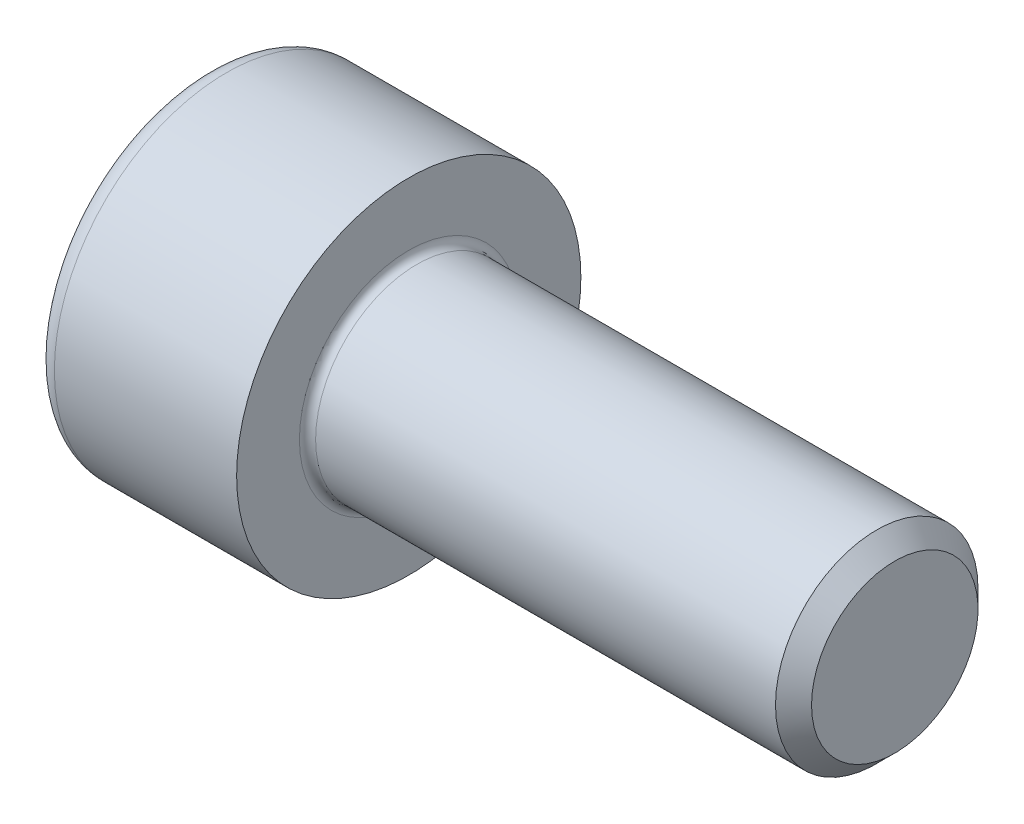
ISO-10303-21;
HEADER;
FILE_DESCRIPTION(('STEP AP214'),'2;1');
FILE_NAME('part.step','',(''),(''),'','','');
FILE_SCHEMA(('AUTOMOTIVE_DESIGN { 1 0 10303 214 1 1 1 1 }'));
ENDSEC;
DATA;
#1=APPLICATION_CONTEXT('core data for automotive mechanical design processes');
#2=APPLICATION_PROTOCOL_DEFINITION('international standard','automotive_design',2000,#1);
#3=PRODUCT_CONTEXT('',#1,'mechanical');
#4=PRODUCT('Part','Part','',(#3));
#5=PRODUCT_RELATED_PRODUCT_CATEGORY('part','',(#4));
#6=PRODUCT_DEFINITION_FORMATION('','',#4);
#7=PRODUCT_DEFINITION_CONTEXT('part definition',#1,'design');
#8=PRODUCT_DEFINITION('design','',#6,#7);
#9=PRODUCT_DEFINITION_SHAPE('','',#8);
#10=(LENGTH_UNIT() NAMED_UNIT(*) SI_UNIT(.MILLI.,.METRE.));
#11=(NAMED_UNIT(*) PLANE_ANGLE_UNIT() SI_UNIT($,.RADIAN.));
#12=(NAMED_UNIT(*) SI_UNIT($,.STERADIAN.) SOLID_ANGLE_UNIT());
#13=UNCERTAINTY_MEASURE_WITH_UNIT(LENGTH_MEASURE(1.E-05),#10,'distance_accuracy_value','');
#14=(GEOMETRIC_REPRESENTATION_CONTEXT(3) GLOBAL_UNCERTAINTY_ASSIGNED_CONTEXT((#13)) GLOBAL_UNIT_ASSIGNED_CONTEXT((#10,
#11,#12)) REPRESENTATION_CONTEXT('',''));
#15=CARTESIAN_POINT('',(0.,0.,0.));
#16=DIRECTION('',(0.,0.,1.));
#17=DIRECTION('',(1.,0.,0.));
#18=AXIS2_PLACEMENT_3D('',#15,#16,#17);
#19=CARTESIAN_POINT('',(2.5,1.16047404107115,2.01));
#20=DIRECTION('',(-1.,0.,0.));
#21=DIRECTION('',(0.,0.,1.));
#22=AXIS2_PLACEMENT_3D('',#19,#20,#21);
#23=PLANE('',#22);
#24=DIRECTION('',(0.,0.500000000000001,0.866025403784438));
#25=VECTOR('',#24,1.);
#26=CARTESIAN_POINT('',(2.5,-1.74071106160672,1.005));
#27=LINE('',#26,#25);
#28=CARTESIAN_POINT('',(2.50000000000648,-1.74071106159992,1.00499999999608));
#29=VERTEX_POINT('',#28);
#30=CARTESIAN_POINT('',(2.5,-1.16047404107115,2.01));
#31=VERTEX_POINT('',#30);
#32=EDGE_CURVE('E106',#29,#31,#27,.T.);
#33=ORIENTED_EDGE('',*,*,#32,.T.);
#34=DIRECTION('',(0.,1.,0.));
#35=VECTOR('',#34,1.);
#36=CARTESIAN_POINT('',(2.5,1.16047404107115,2.01));
#37=LINE('',#36,#35);
#38=CARTESIAN_POINT('',(2.50000000002785,0.,2.00999999995344));
#39=VERTEX_POINT('',#38);
#40=EDGE_CURVE('E101',#31,#39,#37,.T.);
#41=ORIENTED_EDGE('',*,*,#40,.T.);
#42=CARTESIAN_POINT('',(2.50000000001296,0.,0.));
#43=DIRECTION('',(-1.,0.,0.));
#44=DIRECTION('',(0.,0.,1.));
#45=AXIS2_PLACEMENT_3D('',#42,#43,#44);
#46=CIRCLE('',#45,2.0099999999843);
#47=EDGE_CURVE('E103',#39,#29,#46,.F.);
#48=ORIENTED_EDGE('',*,*,#47,.T.);
#49=EDGE_LOOP('',(#33,#41,#48));
#50=FACE_BOUND('',#49,.T.);
#51=ADVANCED_FACE('F16',(#50),#23,.T.);
#52=CARTESIAN_POINT('',(2.5,1.16047404107115,2.01));
#53=DIRECTION('',(-1.,0.,0.));
#54=DIRECTION('',(0.,0.,1.));
#55=AXIS2_PLACEMENT_3D('',#52,#53,#54);
#56=PLANE('',#55);
#57=DIRECTION('',(0.,-0.499999999999998,0.86602540378444));
#58=VECTOR('',#57,1.);
#59=CARTESIAN_POINT('',(2.5,-1.74071106160673,-1.005));
#60=LINE('',#59,#58);
#61=CARTESIAN_POINT('',(2.50000000000648,-1.74071106159993,-1.00499999999608));
#62=VERTEX_POINT('',#61);
#63=CARTESIAN_POINT('',(2.5,-2.3209480821423,0.));
#64=VERTEX_POINT('',#63);
#65=EDGE_CURVE('E110',#62,#64,#60,.T.);
#66=ORIENTED_EDGE('',*,*,#65,.T.);
#67=DIRECTION('',(0.,0.500000000000001,0.866025403784438));
#68=VECTOR('',#67,1.);
#69=CARTESIAN_POINT('',(2.5,-2.3209480821423,0.));
#70=LINE('',#69,#68);
#71=EDGE_CURVE('E178',#64,#29,#70,.T.);
#72=ORIENTED_EDGE('',*,*,#71,.T.);
#73=CARTESIAN_POINT('',(2.50000000001296,0.,0.));
#74=DIRECTION('',(-1.,0.,0.));
#75=DIRECTION('',(0.,0.,1.));
#76=AXIS2_PLACEMENT_3D('',#73,#74,#75);
#77=CIRCLE('',#76,2.0099999999843);
#78=EDGE_CURVE('E122',#29,#62,#77,.F.);
#79=ORIENTED_EDGE('',*,*,#78,.T.);
#80=EDGE_LOOP('',(#66,#72,#79));
#81=FACE_BOUND('',#80,.T.);
#82=ADVANCED_FACE('F365',(#81),#56,.T.);
#83=CARTESIAN_POINT('',(2.5,1.16047404107115,2.01));
#84=DIRECTION('',(-1.,0.,0.));
#85=DIRECTION('',(0.,0.,1.));
#86=AXIS2_PLACEMENT_3D('',#83,#84,#85);
#87=PLANE('',#86);
#88=DIRECTION('',(0.,1.,0.));
#89=VECTOR('',#88,1.);
#90=CARTESIAN_POINT('',(2.5,1.16047404107115,-2.01));
#91=LINE('',#90,#89);
#92=CARTESIAN_POINT('',(2.50000000002785,0.,-2.00999999995345));
#93=VERTEX_POINT('',#92);
#94=CARTESIAN_POINT('',(2.5,-1.16047404107115,-2.01));
#95=VERTEX_POINT('',#94);
#96=EDGE_CURVE('E173',#93,#95,#91,.F.);
#97=ORIENTED_EDGE('',*,*,#96,.T.);
#98=DIRECTION('',(0.,-0.499999999999999,0.866025403784439));
#99=VECTOR('',#98,1.);
#100=CARTESIAN_POINT('',(2.5,-1.16047404107116,-2.01));
#101=LINE('',#100,#99);
#102=EDGE_CURVE('E168',#95,#62,#101,.T.);
#103=ORIENTED_EDGE('',*,*,#102,.T.);
#104=CARTESIAN_POINT('',(2.50000000001296,0.,0.));
#105=DIRECTION('',(-1.,0.,0.));
#106=DIRECTION('',(0.,0.,1.));
#107=AXIS2_PLACEMENT_3D('',#104,#105,#106);
#108=CIRCLE('',#107,2.0099999999843);
#109=EDGE_CURVE('E228',#62,#93,#108,.F.);
#110=ORIENTED_EDGE('',*,*,#109,.T.);
#111=EDGE_LOOP('',(#97,#103,#110));
#112=FACE_BOUND('',#111,.T.);
#113=ADVANCED_FACE('F360',(#112),#87,.T.);
#114=CARTESIAN_POINT('',(2.5,1.16047404107115,2.01));
#115=DIRECTION('',(-1.,0.,0.));
#116=DIRECTION('',(0.,0.,1.));
#117=AXIS2_PLACEMENT_3D('',#114,#115,#116);
#118=PLANE('',#117);
#119=DIRECTION('',(0.,-0.500000000000001,-0.866025403784438));
#120=VECTOR('',#119,1.);
#121=CARTESIAN_POINT('',(2.5,1.74071106160672,-1.005));
#122=LINE('',#121,#120);
#123=CARTESIAN_POINT('',(2.50000000000648,1.74071106159992,-1.00499999999608));
#124=VERTEX_POINT('',#123);
#125=CARTESIAN_POINT('',(2.5,1.16047404107114,-2.01));
#126=VERTEX_POINT('',#125);
#127=EDGE_CURVE('E163',#124,#126,#122,.T.);
#128=ORIENTED_EDGE('',*,*,#127,.T.);
#129=DIRECTION('',(0.,1.,0.));
#130=VECTOR('',#129,1.);
#131=CARTESIAN_POINT('',(2.5,1.16047404107115,-2.01));
#132=LINE('',#131,#130);
#133=EDGE_CURVE('E158',#126,#93,#132,.F.);
#134=ORIENTED_EDGE('',*,*,#133,.T.);
#135=CARTESIAN_POINT('',(2.50000000001296,0.,0.));
#136=DIRECTION('',(-1.,0.,0.));
#137=DIRECTION('',(0.,0.,1.));
#138=AXIS2_PLACEMENT_3D('',#135,#136,#137);
#139=CIRCLE('',#138,2.0099999999843);
#140=EDGE_CURVE('E225',#93,#124,#139,.F.);
#141=ORIENTED_EDGE('',*,*,#140,.T.);
#142=EDGE_LOOP('',(#128,#134,#141));
#143=FACE_BOUND('',#142,.T.);
#144=ADVANCED_FACE('F354',(#143),#118,.T.);
#145=CARTESIAN_POINT('',(2.5,1.16047404107115,2.01));
#146=DIRECTION('',(-1.,0.,0.));
#147=DIRECTION('',(0.,0.,1.));
#148=AXIS2_PLACEMENT_3D('',#145,#146,#147);
#149=PLANE('',#148);
#150=DIRECTION('',(0.,0.499999999999996,-0.866025403784441));
#151=VECTOR('',#150,1.);
#152=CARTESIAN_POINT('',(2.5,1.74071106160672,1.005));
#153=LINE('',#152,#151);
#154=CARTESIAN_POINT('',(2.50000000000648,1.74071106159993,1.00499999999607));
#155=VERTEX_POINT('',#154);
#156=CARTESIAN_POINT('',(2.5,2.32094808214229,0.));
#157=VERTEX_POINT('',#156);
#158=EDGE_CURVE('E153',#155,#157,#153,.T.);
#159=ORIENTED_EDGE('',*,*,#158,.T.);
#160=DIRECTION('',(0.,-0.500000000000002,-0.866025403784438));
#161=VECTOR('',#160,1.);
#162=CARTESIAN_POINT('',(2.5,2.32094808214229,0.));
#163=LINE('',#162,#161);
#164=EDGE_CURVE('E123',#157,#124,#163,.T.);
#165=ORIENTED_EDGE('',*,*,#164,.T.);
#166=CARTESIAN_POINT('',(2.50000000001296,0.,0.));
#167=DIRECTION('',(-1.,0.,0.));
#168=DIRECTION('',(0.,0.,1.));
#169=AXIS2_PLACEMENT_3D('',#166,#167,#168);
#170=CIRCLE('',#169,2.0099999999843);
#171=EDGE_CURVE('E130',#124,#155,#170,.F.);
#172=ORIENTED_EDGE('',*,*,#171,.T.);
#173=EDGE_LOOP('',(#159,#165,#172));
#174=FACE_BOUND('',#173,.T.);
#175=ADVANCED_FACE('F351',(#174),#149,.T.);
#176=CARTESIAN_POINT('',(2.50000000011141,0.,0.));
#177=DIRECTION('',(-1.,0.,0.));
#178=DIRECTION('',(0.,0.,1.));
#179=AXIS2_PLACEMENT_3D('',#176,#177,#178);
#180=CONICAL_SURFACE('',#179,2.00999999981377,1.04719755104565);
#181=CARTESIAN_POINT('',(3.66047404099845,0.,1.13686837721616E-10));
#182=VERTEX_POINT('',#181);
#183=VERTEX_LOOP('',#182);
#184=FACE_BOUND('',#183,.T.);
#185=ORIENTED_EDGE('',*,*,#47,.F.);
#186=CARTESIAN_POINT('',(2.50000000001296,0.,0.));
#187=DIRECTION('',(-1.,0.,0.));
#188=DIRECTION('',(0.,0.,1.));
#189=AXIS2_PLACEMENT_3D('',#186,#187,#188);
#190=CIRCLE('',#189,2.0099999999843);
#191=EDGE_CURVE('E118',#155,#39,#190,.F.);
#192=ORIENTED_EDGE('',*,*,#191,.F.);
#193=ORIENTED_EDGE('',*,*,#171,.F.);
#194=ORIENTED_EDGE('',*,*,#140,.F.);
#195=ORIENTED_EDGE('',*,*,#109,.F.);
#196=ORIENTED_EDGE('',*,*,#78,.F.);
#197=EDGE_LOOP('',(#185,#192,#193,#194,#195,#196));
#198=FACE_BOUND('',#197,.T.);
#199=ADVANCED_FACE('F116',(#184,#198),#180,.F.);
#200=CARTESIAN_POINT('',(2.5,1.16047404107115,2.01));
#201=DIRECTION('',(-1.,0.,0.));
#202=DIRECTION('',(0.,0.,1.));
#203=AXIS2_PLACEMENT_3D('',#200,#201,#202);
#204=PLANE('',#203);
#205=DIRECTION('',(0.,-1.,0.));
#206=VECTOR('',#205,1.);
#207=CARTESIAN_POINT('',(2.5,-1.16047404107115,2.01));
#208=LINE('',#207,#206);
#209=CARTESIAN_POINT('',(2.5,1.16047404107115,2.01));
#210=VERTEX_POINT('',#209);
#211=EDGE_CURVE('E127',#39,#210,#208,.F.);
#212=ORIENTED_EDGE('',*,*,#211,.T.);
#213=DIRECTION('',(0.,0.499999999999999,-0.866025403784439));
#214=VECTOR('',#213,1.);
#215=CARTESIAN_POINT('',(2.5,2.32094808214229,0.));
#216=LINE('',#215,#214);
#217=EDGE_CURVE('E129',#155,#210,#216,.F.);
#218=ORIENTED_EDGE('',*,*,#217,.F.);
#219=ORIENTED_EDGE('',*,*,#191,.T.);
#220=EDGE_LOOP('',(#212,#218,#219));
#221=FACE_BOUND('',#220,.T.);
#222=ADVANCED_FACE('F126',(#221),#204,.T.);
#223=CARTESIAN_POINT('',(2.5,2.32094808214229,0.));
#224=DIRECTION('',(0.,-0.866025403784439,-0.499999999999999));
#225=DIRECTION('',(0.,0.499999999999999,-0.866025403784439));
#226=AXIS2_PLACEMENT_3D('',#223,#224,#225);
#227=PLANE('',#226);
#228=ORIENTED_EDGE('',*,*,#217,.T.);
#229=DIRECTION('',(1.,0.,0.));
#230=VECTOR('',#229,1.);
#231=CARTESIAN_POINT('',(2.5,1.16047404107115,2.01));
#232=LINE('',#231,#230);
#233=CARTESIAN_POINT('',(0.,1.16047404107115,2.01));
#234=VERTEX_POINT('',#233);
#235=EDGE_CURVE('E135',#210,#234,#232,.F.);
#236=ORIENTED_EDGE('',*,*,#235,.T.);
#237=DIRECTION('',(0.,-0.499999999999999,0.866025403784439));
#238=VECTOR('',#237,1.);
#239=CARTESIAN_POINT('',(0.,2.32094808214229,0.));
#240=LINE('',#239,#238);
#241=CARTESIAN_POINT('',(0.,2.32094808214229,0.));
#242=VERTEX_POINT('',#241);
#243=EDGE_CURVE('E201',#242,#234,#240,.T.);
#244=ORIENTED_EDGE('',*,*,#243,.F.);
#245=DIRECTION('',(1.,0.,0.));
#246=VECTOR('',#245,1.);
#247=CARTESIAN_POINT('',(2.5,2.32094808214229,0.));
#248=LINE('',#247,#246);
#249=EDGE_CURVE('E193',#242,#157,#248,.T.);
#250=ORIENTED_EDGE('',*,*,#249,.T.);
#251=ORIENTED_EDGE('',*,*,#158,.F.);
#252=EDGE_LOOP('',(#228,#236,#244,#250,#251));
#253=FACE_BOUND('',#252,.T.);
#254=ADVANCED_FACE('F347',(#253),#227,.T.);
#255=CARTESIAN_POINT('',(2.5,-1.16047404107115,2.01));
#256=DIRECTION('',(0.,0.,1.));
#257=DIRECTION('',(0.,-1.,0.));
#258=AXIS2_PLACEMENT_3D('',#255,#256,#257);
#259=PLANE('',#258);
#260=ORIENTED_EDGE('',*,*,#235,.F.);
#261=ORIENTED_EDGE('',*,*,#211,.F.);
#262=ORIENTED_EDGE('',*,*,#40,.F.);
#263=DIRECTION('',(1.,0.,0.));
#264=VECTOR('',#263,1.);
#265=CARTESIAN_POINT('',(2.5,-1.16047404107115,2.01));
#266=LINE('',#265,#264);
#267=CARTESIAN_POINT('',(0.,-1.16047404107115,2.01));
#268=VERTEX_POINT('',#267);
#269=EDGE_CURVE('E137',#268,#31,#266,.T.);
#270=ORIENTED_EDGE('',*,*,#269,.F.);
#271=DIRECTION('',(0.,1.,0.));
#272=VECTOR('',#271,1.);
#273=CARTESIAN_POINT('',(0.,0.,2.01));
#274=LINE('',#273,#272);
#275=EDGE_CURVE('E342',#234,#268,#274,.F.);
#276=ORIENTED_EDGE('',*,*,#275,.F.);
#277=EDGE_LOOP('',(#260,#261,#262,#270,#276));
#278=FACE_BOUND('',#277,.T.);
#279=ADVANCED_FACE('F133',(#278),#259,.F.);
#280=CARTESIAN_POINT('',(2.5,-1.16047404107115,2.01));
#281=DIRECTION('',(0.,0.866025403784438,-0.500000000000001));
#282=DIRECTION('',(0.,0.500000000000001,0.866025403784438));
#283=AXIS2_PLACEMENT_3D('',#280,#281,#282);
#284=PLANE('',#283);
#285=ORIENTED_EDGE('',*,*,#71,.F.);
#286=DIRECTION('',(1.,0.,0.));
#287=VECTOR('',#286,1.);
#288=CARTESIAN_POINT('',(2.5,-2.3209480821423,0.));
#289=LINE('',#288,#287);
#290=CARTESIAN_POINT('',(0.,-2.3209480821423,0.));
#291=VERTEX_POINT('',#290);
#292=EDGE_CURVE('E205',#291,#64,#289,.T.);
#293=ORIENTED_EDGE('',*,*,#292,.F.);
#294=DIRECTION('',(0.,-0.500000000000001,-0.866025403784438));
#295=VECTOR('',#294,1.);
#296=CARTESIAN_POINT('',(0.,-1.16047404107115,2.01));
#297=LINE('',#296,#295);
#298=EDGE_CURVE('E339',#268,#291,#297,.T.);
#299=ORIENTED_EDGE('',*,*,#298,.F.);
#300=ORIENTED_EDGE('',*,*,#269,.T.);
#301=ORIENTED_EDGE('',*,*,#32,.F.);
#302=EDGE_LOOP('',(#285,#293,#299,#300,#301));
#303=FACE_BOUND('',#302,.T.);
#304=ADVANCED_FACE('F367',(#303),#284,.T.);
#305=CARTESIAN_POINT('',(2.5,-2.3209480821423,0.));
#306=DIRECTION('',(0.,0.866025403784439,0.499999999999999));
#307=DIRECTION('',(0.,-0.499999999999999,0.866025403784439));
#308=AXIS2_PLACEMENT_3D('',#305,#306,#307);
#309=PLANE('',#308);
#310=ORIENTED_EDGE('',*,*,#102,.F.);
#311=DIRECTION('',(1.,0.,0.));
#312=VECTOR('',#311,1.);
#313=CARTESIAN_POINT('',(2.5,-1.16047404107116,-2.01));
#314=LINE('',#313,#312);
#315=CARTESIAN_POINT('',(0.,-1.16047404107116,-2.01));
#316=VERTEX_POINT('',#315);
#317=EDGE_CURVE('E197',#95,#316,#314,.F.);
#318=ORIENTED_EDGE('',*,*,#317,.T.);
#319=DIRECTION('',(0.,0.499999999999999,-0.86602540378444));
#320=VECTOR('',#319,1.);
#321=CARTESIAN_POINT('',(0.,-2.3209480821423,0.));
#322=LINE('',#321,#320);
#323=EDGE_CURVE('E334',#291,#316,#322,.T.);
#324=ORIENTED_EDGE('',*,*,#323,.F.);
#325=ORIENTED_EDGE('',*,*,#292,.T.);
#326=ORIENTED_EDGE('',*,*,#65,.F.);
#327=EDGE_LOOP('',(#310,#318,#324,#325,#326));
#328=FACE_BOUND('',#327,.T.);
#329=ADVANCED_FACE('F362',(#328),#309,.T.);
#330=CARTESIAN_POINT('',(2.5,1.16047404107114,-2.01));
#331=DIRECTION('',(0.,0.,-1.));
#332=DIRECTION('',(0.,1.,0.));
#333=AXIS2_PLACEMENT_3D('',#330,#331,#332);
#334=PLANE('',#333);
#335=ORIENTED_EDGE('',*,*,#317,.F.);
#336=ORIENTED_EDGE('',*,*,#96,.F.);
#337=ORIENTED_EDGE('',*,*,#133,.F.);
#338=DIRECTION('',(1.,0.,0.));
#339=VECTOR('',#338,1.);
#340=CARTESIAN_POINT('',(2.5,1.16047404107114,-2.01));
#341=LINE('',#340,#339);
#342=CARTESIAN_POINT('',(0.,1.16047404107114,-2.01));
#343=VERTEX_POINT('',#342);
#344=EDGE_CURVE('E196',#126,#343,#341,.F.);
#345=ORIENTED_EDGE('',*,*,#344,.T.);
#346=DIRECTION('',(0.,1.,0.));
#347=VECTOR('',#346,1.);
#348=CARTESIAN_POINT('',(0.,0.,-2.01));
#349=LINE('',#348,#347);
#350=EDGE_CURVE('E330',#316,#343,#349,.T.);
#351=ORIENTED_EDGE('',*,*,#350,.F.);
#352=EDGE_LOOP('',(#335,#336,#337,#345,#351));
#353=FACE_BOUND('',#352,.T.);
#354=ADVANCED_FACE('F357',(#353),#334,.F.);
#355=CARTESIAN_POINT('',(2.5,2.32094808214229,0.));
#356=DIRECTION('',(0.,0.866025403784438,-0.500000000000001));
#357=DIRECTION('',(0.,0.500000000000001,0.866025403784438));
#358=AXIS2_PLACEMENT_3D('',#355,#356,#357);
#359=PLANE('',#358);
#360=ORIENTED_EDGE('',*,*,#344,.F.);
#361=ORIENTED_EDGE('',*,*,#127,.F.);
#362=ORIENTED_EDGE('',*,*,#164,.F.);
#363=ORIENTED_EDGE('',*,*,#249,.F.);
#364=DIRECTION('',(0.,0.500000000000002,0.866025403784438));
#365=VECTOR('',#364,1.);
#366=CARTESIAN_POINT('',(0.,1.16047404107114,-2.01));
#367=LINE('',#366,#365);
#368=EDGE_CURVE('E328',#343,#242,#367,.T.);
#369=ORIENTED_EDGE('',*,*,#368,.F.);
#370=EDGE_LOOP('',(#360,#361,#362,#363,#369));
#371=FACE_BOUND('',#370,.T.);
#372=ADVANCED_FACE('F304',(#371),#359,.F.);
#373=CARTESIAN_POINT('',(0.,0.,0.));
#374=DIRECTION('',(-1.,0.,0.));
#375=DIRECTION('',(0.,0.,1.));
#376=AXIS2_PLACEMENT_3D('',#373,#374,#375);
#377=PLANE('',#376);
#378=CARTESIAN_POINT('',(0.,0.,0.));
#379=DIRECTION('',(1.,0.,0.));
#380=DIRECTION('',(0.,0.,-1.));
#381=AXIS2_PLACEMENT_3D('',#378,#379,#380);
#382=CIRCLE('',#381,3.75);
#383=CARTESIAN_POINT('',(0.,0.,-3.75));
#384=VERTEX_POINT('',#383);
#385=CARTESIAN_POINT('',(0.,0.,3.75));
#386=VERTEX_POINT('',#385);
#387=EDGE_CURVE('E325',#384,#386,#382,.T.);
#388=ORIENTED_EDGE('',*,*,#387,.F.);
#389=CARTESIAN_POINT('',(0.,0.,0.));
#390=DIRECTION('',(1.,0.,0.));
#391=DIRECTION('',(0.,0.,1.));
#392=AXIS2_PLACEMENT_3D('',#389,#390,#391);
#393=CIRCLE('',#392,3.75);
#394=EDGE_CURVE('E323',#386,#384,#393,.T.);
#395=ORIENTED_EDGE('',*,*,#394,.F.);
#396=EDGE_LOOP('',(#388,#395));
#397=FACE_BOUND('',#396,.T.);
#398=ORIENTED_EDGE('',*,*,#350,.T.);
#399=ORIENTED_EDGE('',*,*,#368,.T.);
#400=ORIENTED_EDGE('',*,*,#243,.T.);
#401=ORIENTED_EDGE('',*,*,#275,.T.);
#402=ORIENTED_EDGE('',*,*,#298,.T.);
#403=ORIENTED_EDGE('',*,*,#323,.T.);
#404=EDGE_LOOP('',(#398,#399,#400,#401,#402,#403));
#405=FACE_BOUND('',#404,.T.);
#406=ADVANCED_FACE('F298',(#397,#405),#377,.T.);
#407=CARTESIAN_POINT('',(0.5,0.,0.));
#408=DIRECTION('',(-1.,0.,0.));
#409=DIRECTION('',(0.,0.,1.));
#410=AXIS2_PLACEMENT_3D('',#407,#408,#409);
#411=TOROIDAL_SURFACE('',#410,3.75,0.5);
#412=CARTESIAN_POINT('',(0.5,0.,0.));
#413=DIRECTION('',(-1.,0.,0.));
#414=DIRECTION('',(0.,0.,1.));
#415=AXIS2_PLACEMENT_3D('',#412,#413,#414);
#416=CIRCLE('',#415,4.25);
#417=CARTESIAN_POINT('',(0.5,0.,4.25));
#418=VERTEX_POINT('',#417);
#419=EDGE_CURVE('E221',#418,#418,#416,.F.);
#420=ORIENTED_EDGE('',*,*,#419,.F.);
#421=EDGE_LOOP('',(#420));
#422=FACE_BOUND('',#421,.T.);
#423=ORIENTED_EDGE('',*,*,#394,.T.);
#424=ORIENTED_EDGE('',*,*,#387,.T.);
#425=EDGE_LOOP('',(#423,#424));
#426=FACE_BOUND('',#425,.T.);
#427=ADVANCED_FACE('F293',(#422,#426),#411,.T.);
#428=CARTESIAN_POINT('',(-31.75,0.,0.));
#429=DIRECTION('',(-1.,0.,0.));
#430=DIRECTION('',(0.,0.,1.));
#431=AXIS2_PLACEMENT_3D('',#428,#429,#430);
#432=CYLINDRICAL_SURFACE('',#431,4.25);
#433=CARTESIAN_POINT('',(5.,0.,0.));
#434=DIRECTION('',(-1.,0.,0.));
#435=DIRECTION('',(0.,0.,1.));
#436=AXIS2_PLACEMENT_3D('',#433,#434,#435);
#437=CIRCLE('',#436,4.25);
#438=CARTESIAN_POINT('',(5.,0.,4.25));
#439=VERTEX_POINT('',#438);
#440=EDGE_CURVE('E219',#439,#439,#437,.F.);
#441=ORIENTED_EDGE('',*,*,#440,.F.);
#442=EDGE_LOOP('',(#441));
#443=FACE_BOUND('',#442,.T.);
#444=ORIENTED_EDGE('',*,*,#419,.T.);
#445=EDGE_LOOP('',(#444));
#446=FACE_BOUND('',#445,.T.);
#447=ADVANCED_FACE('F297',(#443,#446),#432,.T.);
#448=CARTESIAN_POINT('',(17.,2.055,0.));
#449=DIRECTION('',(1.,0.,0.));
#450=DIRECTION('',(0.,0.,-1.));
#451=AXIS2_PLACEMENT_3D('',#448,#449,#450);
#452=PLANE('',#451);
#453=CARTESIAN_POINT('',(16.9999999999959,0.,0.));
#454=DIRECTION('',(-1.,0.,0.));
#455=DIRECTION('',(0.,0.,1.));
#456=AXIS2_PLACEMENT_3D('',#453,#454,#455);
#457=CIRCLE('',#456,2.05499999998437);
#458=CARTESIAN_POINT('',(16.9999999999959,0.,2.05499999998437));
#459=VERTEX_POINT('',#458);
#460=EDGE_CURVE('E215',#459,#459,#457,.T.);
#461=ORIENTED_EDGE('',*,*,#460,.F.);
#462=EDGE_LOOP('',(#461));
#463=FACE_BOUND('',#462,.T.);
#464=ADVANCED_FACE('F270',(#463),#452,.T.);
#465=CARTESIAN_POINT('',(5.,4.25,0.));
#466=DIRECTION('',(1.,0.,0.));
#467=DIRECTION('',(0.,0.,-1.));
#468=AXIS2_PLACEMENT_3D('',#465,#466,#467);
#469=PLANE('',#468);
#470=ORIENTED_EDGE('',*,*,#440,.T.);
#471=EDGE_LOOP('',(#470));
#472=FACE_BOUND('',#471,.T.);
#473=CARTESIAN_POINT('',(5.,0.,0.));
#474=DIRECTION('',(1.,0.,0.));
#475=DIRECTION('',(0.,0.,1.));
#476=AXIS2_PLACEMENT_3D('',#473,#474,#475);
#477=CIRCLE('',#476,2.7);
#478=CARTESIAN_POINT('',(5.,0.,-2.7));
#479=VERTEX_POINT('',#478);
#480=CARTESIAN_POINT('',(5.,0.,2.7));
#481=VERTEX_POINT('',#480);
#482=EDGE_CURVE('E218',#479,#481,#477,.F.);
#483=ORIENTED_EDGE('',*,*,#482,.T.);
#484=CARTESIAN_POINT('',(5.,0.,0.));
#485=DIRECTION('',(1.,0.,0.));
#486=DIRECTION('',(0.,0.,-1.));
#487=AXIS2_PLACEMENT_3D('',#484,#485,#486);
#488=CIRCLE('',#487,2.7);
#489=EDGE_CURVE('E35',#481,#479,#488,.F.);
#490=ORIENTED_EDGE('',*,*,#489,.T.);
#491=EDGE_LOOP('',(#483,#490));
#492=FACE_BOUND('',#491,.T.);
#493=ADVANCED_FACE('F261',(#472,#492),#469,.T.);
#494=CARTESIAN_POINT('',(16.5549999999826,0.,0.));
#495=DIRECTION('',(-1.,0.,0.));
#496=DIRECTION('',(0.,0.,1.));
#497=AXIS2_PLACEMENT_3D('',#494,#495,#496);
#498=CONICAL_SURFACE('',#497,2.49999999999773,0.785398163397448);
#499=CARTESIAN_POINT('',(16.555,0.,0.));
#500=DIRECTION('',(-1.,0.,0.));
#501=DIRECTION('',(0.,0.,1.));
#502=AXIS2_PLACEMENT_3D('',#499,#500,#501);
#503=CIRCLE('',#502,2.5);
#504=CARTESIAN_POINT('',(16.555,0.,2.5));
#505=VERTEX_POINT('',#504);
#506=EDGE_CURVE('E27',#505,#505,#503,.T.);
#507=ORIENTED_EDGE('',*,*,#506,.F.);
#508=EDGE_LOOP('',(#507));
#509=FACE_BOUND('',#508,.T.);
#510=ORIENTED_EDGE('',*,*,#460,.T.);
#511=EDGE_LOOP('',(#510));
#512=FACE_BOUND('',#511,.T.);
#513=ADVANCED_FACE('F249',(#509,#512),#498,.T.);
#514=CARTESIAN_POINT('',(5.2,0.,0.));
#515=DIRECTION('',(1.,0.,0.));
#516=DIRECTION('',(0.,0.,-1.));
#517=AXIS2_PLACEMENT_3D('',#514,#515,#516);
#518=TOROIDAL_SURFACE('',#517,2.7,0.2);
#519=CARTESIAN_POINT('',(5.2,0.,0.));
#520=DIRECTION('',(-1.,0.,0.));
#521=DIRECTION('',(0.,0.,1.));
#522=AXIS2_PLACEMENT_3D('',#519,#520,#521);
#523=CIRCLE('',#522,2.5);
#524=CARTESIAN_POINT('',(5.2,0.,2.5));
#525=VERTEX_POINT('',#524);
#526=EDGE_CURVE('E11',#525,#525,#523,.F.);
#527=ORIENTED_EDGE('',*,*,#526,.F.);
#528=EDGE_LOOP('',(#527));
#529=FACE_BOUND('',#528,.T.);
#530=ORIENTED_EDGE('',*,*,#482,.F.);
#531=ORIENTED_EDGE('',*,*,#489,.F.);
#532=EDGE_LOOP('',(#530,#531));
#533=FACE_BOUND('',#532,.T.);
#534=ADVANCED_FACE('F237',(#529,#533),#518,.F.);
#535=CARTESIAN_POINT('',(-31.75,0.,0.));
#536=DIRECTION('',(-1.,0.,0.));
#537=DIRECTION('',(0.,0.,1.));
#538=AXIS2_PLACEMENT_3D('',#535,#536,#537);
#539=CYLINDRICAL_SURFACE('',#538,2.5);
#540=ORIENTED_EDGE('',*,*,#526,.T.);
#541=EDGE_LOOP('',(#540));
#542=FACE_BOUND('',#541,.T.);
#543=ORIENTED_EDGE('',*,*,#506,.T.);
#544=EDGE_LOOP('',(#543));
#545=FACE_BOUND('',#544,.T.);
#546=ADVANCED_FACE('F248',(#542,#545),#539,.T.);
#547=CLOSED_SHELL('',(#51,#82,#113,#144,#175,#199,#222,#254,#279,#304,#329,#354,#372,#406,#427,
#447,#464,#493,#513,#534,#546));
#548=MANIFOLD_SOLID_BREP('B1',#547);
#549=ADVANCED_BREP_SHAPE_REPRESENTATION('',(#18,#548),#14);
#550=SHAPE_DEFINITION_REPRESENTATION(#9,#549);
ENDSEC;
END-ISO-10303-21;
